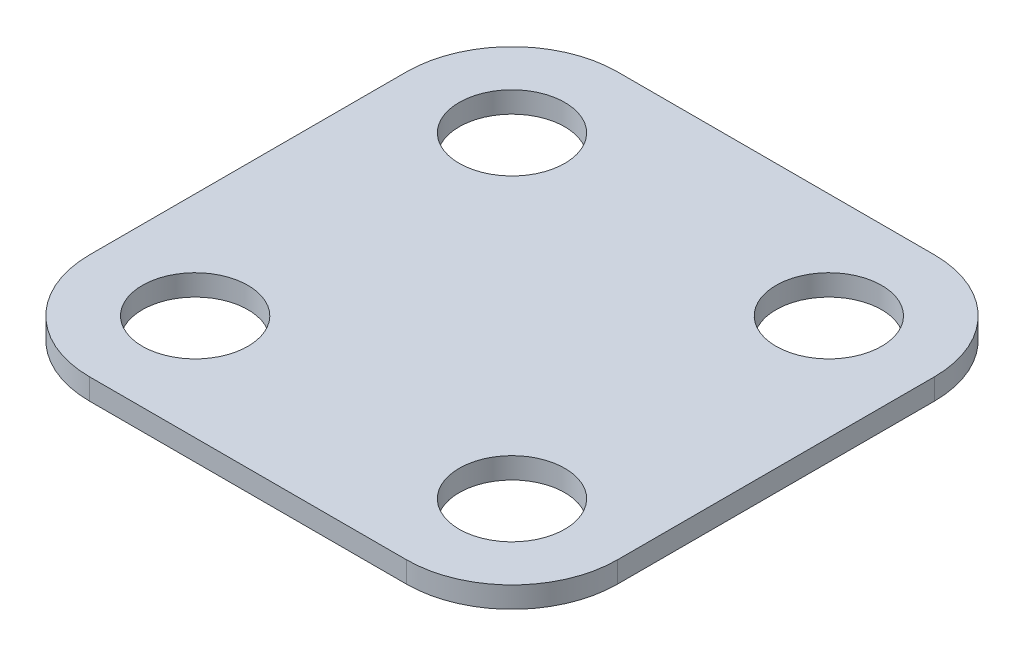
ISO-10303-21;
HEADER;
FILE_DESCRIPTION(('STEP AP214'),'2;1');
FILE_NAME('part.step','',(''),(''),'','','');
FILE_SCHEMA(('AUTOMOTIVE_DESIGN { 1 0 10303 214 1 1 1 1 }'));
ENDSEC;
DATA;
#1=APPLICATION_CONTEXT('core data for automotive mechanical design processes');
#2=APPLICATION_PROTOCOL_DEFINITION('international standard','automotive_design',2000,#1);
#3=PRODUCT_CONTEXT('',#1,'mechanical');
#4=PRODUCT('Part','Part','',(#3));
#5=PRODUCT_RELATED_PRODUCT_CATEGORY('part','',(#4));
#6=PRODUCT_DEFINITION_FORMATION('','',#4);
#7=PRODUCT_DEFINITION_CONTEXT('part definition',#1,'design');
#8=PRODUCT_DEFINITION('design','',#6,#7);
#9=PRODUCT_DEFINITION_SHAPE('','',#8);
#10=(LENGTH_UNIT() NAMED_UNIT(*) SI_UNIT(.MILLI.,.METRE.));
#11=(NAMED_UNIT(*) PLANE_ANGLE_UNIT() SI_UNIT($,.RADIAN.));
#12=(NAMED_UNIT(*) SI_UNIT($,.STERADIAN.) SOLID_ANGLE_UNIT());
#13=UNCERTAINTY_MEASURE_WITH_UNIT(LENGTH_MEASURE(1.E-05),#10,'distance_accuracy_value','');
#14=(GEOMETRIC_REPRESENTATION_CONTEXT(3) GLOBAL_UNCERTAINTY_ASSIGNED_CONTEXT((#13)) GLOBAL_UNIT_ASSIGNED_CONTEXT((#10,
#11,#12)) REPRESENTATION_CONTEXT('',''));
#15=CARTESIAN_POINT('',(0.,0.,0.));
#16=DIRECTION('',(0.,0.,1.));
#17=DIRECTION('',(1.,0.,0.));
#18=AXIS2_PLACEMENT_3D('',#15,#16,#17);
#19=CARTESIAN_POINT('',(-15.,-2.,-15.));
#20=DIRECTION('',(0.,1.,0.));
#21=DIRECTION('',(0.,0.,1.));
#22=AXIS2_PLACEMENT_3D('',#19,#20,#21);
#23=CYLINDRICAL_SURFACE('',#22,10.);
#24=CARTESIAN_POINT('',(-15.,0.,-15.));
#25=DIRECTION('',(0.,1.,0.));
#26=DIRECTION('',(0.,0.,1.));
#27=AXIS2_PLACEMENT_3D('',#24,#25,#26);
#28=CIRCLE('',#27,10.);
#29=CARTESIAN_POINT('',(-15.,0.,-25.));
#30=VERTEX_POINT('',#29);
#31=CARTESIAN_POINT('',(-25.,0.,-15.));
#32=VERTEX_POINT('',#31);
#33=EDGE_CURVE('E134',#30,#32,#28,.T.);
#34=ORIENTED_EDGE('',*,*,#33,.F.);
#35=DIRECTION('',(0.,1.,0.));
#36=VECTOR('',#35,1.);
#37=CARTESIAN_POINT('',(-15.,-2.,-25.));
#38=LINE('',#37,#36);
#39=CARTESIAN_POINT('',(-15.,-2.,-25.));
#40=VERTEX_POINT('',#39);
#41=EDGE_CURVE('E11',#40,#30,#38,.T.);
#42=ORIENTED_EDGE('',*,*,#41,.F.);
#43=CARTESIAN_POINT('',(-15.,-2.,-15.));
#44=DIRECTION('',(0.,1.,0.));
#45=DIRECTION('',(0.,0.,1.));
#46=AXIS2_PLACEMENT_3D('',#43,#44,#45);
#47=CIRCLE('',#46,10.);
#48=CARTESIAN_POINT('',(-25.,-2.,-15.));
#49=VERTEX_POINT('',#48);
#50=EDGE_CURVE('E155',#40,#49,#47,.T.);
#51=ORIENTED_EDGE('',*,*,#50,.T.);
#52=DIRECTION('',(0.,1.,0.));
#53=VECTOR('',#52,1.);
#54=CARTESIAN_POINT('',(-25.,-2.,-15.));
#55=LINE('',#54,#53);
#56=EDGE_CURVE('E40',#49,#32,#55,.T.);
#57=ORIENTED_EDGE('',*,*,#56,.T.);
#58=EDGE_LOOP('',(#34,#42,#51,#57));
#59=FACE_BOUND('',#58,.T.);
#60=ADVANCED_FACE('F37',(#59),#23,.T.);
#61=CARTESIAN_POINT('',(-15.,-2.,-25.));
#62=DIRECTION('',(0.,0.,-1.));
#63=DIRECTION('',(-1.,0.,0.));
#64=AXIS2_PLACEMENT_3D('',#61,#62,#63);
#65=PLANE('',#64);
#66=DIRECTION('',(-1.,0.,0.));
#67=VECTOR('',#66,1.);
#68=CARTESIAN_POINT('',(-15.,0.,-25.));
#69=LINE('',#68,#67);
#70=CARTESIAN_POINT('',(15.,0.,-25.));
#71=VERTEX_POINT('',#70);
#72=EDGE_CURVE('E153',#71,#30,#69,.T.);
#73=ORIENTED_EDGE('',*,*,#72,.F.);
#74=DIRECTION('',(0.,1.,0.));
#75=VECTOR('',#74,1.);
#76=CARTESIAN_POINT('',(15.,-2.,-25.));
#77=LINE('',#76,#75);
#78=CARTESIAN_POINT('',(15.,-2.,-25.));
#79=VERTEX_POINT('',#78);
#80=EDGE_CURVE('E46',#79,#71,#77,.T.);
#81=ORIENTED_EDGE('',*,*,#80,.F.);
#82=DIRECTION('',(-1.,0.,0.));
#83=VECTOR('',#82,1.);
#84=CARTESIAN_POINT('',(-15.,-2.,-25.));
#85=LINE('',#84,#83);
#86=EDGE_CURVE('E124',#79,#40,#85,.T.);
#87=ORIENTED_EDGE('',*,*,#86,.T.);
#88=ORIENTED_EDGE('',*,*,#41,.T.);
#89=EDGE_LOOP('',(#73,#81,#87,#88));
#90=FACE_BOUND('',#89,.T.);
#91=ADVANCED_FACE('F167',(#90),#65,.T.);
#92=CARTESIAN_POINT('',(15.,-2.,-15.));
#93=DIRECTION('',(0.,1.,0.));
#94=DIRECTION('',(0.,0.,1.));
#95=AXIS2_PLACEMENT_3D('',#92,#93,#94);
#96=CYLINDRICAL_SURFACE('',#95,10.);
#97=CARTESIAN_POINT('',(15.,0.,-15.));
#98=DIRECTION('',(0.,1.,0.));
#99=DIRECTION('',(0.,0.,-1.));
#100=AXIS2_PLACEMENT_3D('',#97,#98,#99);
#101=CIRCLE('',#100,10.);
#102=CARTESIAN_POINT('',(25.,0.,-15.));
#103=VERTEX_POINT('',#102);
#104=EDGE_CURVE('E111',#103,#71,#101,.T.);
#105=ORIENTED_EDGE('',*,*,#104,.F.);
#106=DIRECTION('',(0.,1.,0.));
#107=VECTOR('',#106,1.);
#108=CARTESIAN_POINT('',(25.,-2.,-15.));
#109=LINE('',#108,#107);
#110=CARTESIAN_POINT('',(25.,-2.,-15.));
#111=VERTEX_POINT('',#110);
#112=EDGE_CURVE('E106',#111,#103,#109,.T.);
#113=ORIENTED_EDGE('',*,*,#112,.F.);
#114=CARTESIAN_POINT('',(15.,-2.,-15.));
#115=DIRECTION('',(0.,1.,0.));
#116=DIRECTION('',(0.,0.,-1.));
#117=AXIS2_PLACEMENT_3D('',#114,#115,#116);
#118=CIRCLE('',#117,10.);
#119=EDGE_CURVE('E109',#111,#79,#118,.T.);
#120=ORIENTED_EDGE('',*,*,#119,.T.);
#121=ORIENTED_EDGE('',*,*,#80,.T.);
#122=EDGE_LOOP('',(#105,#113,#120,#121));
#123=FACE_BOUND('',#122,.T.);
#124=ADVANCED_FACE('F108',(#123),#96,.T.);
#125=CARTESIAN_POINT('',(25.,-2.,-15.));
#126=DIRECTION('',(1.,0.,0.));
#127=DIRECTION('',(0.,0.,-1.));
#128=AXIS2_PLACEMENT_3D('',#125,#126,#127);
#129=PLANE('',#128);
#130=DIRECTION('',(0.,0.,-1.));
#131=VECTOR('',#130,1.);
#132=CARTESIAN_POINT('',(25.,0.,-15.));
#133=LINE('',#132,#131);
#134=CARTESIAN_POINT('',(25.,0.,15.));
#135=VERTEX_POINT('',#134);
#136=EDGE_CURVE('E150',#135,#103,#133,.T.);
#137=ORIENTED_EDGE('',*,*,#136,.F.);
#138=DIRECTION('',(0.,1.,0.));
#139=VECTOR('',#138,1.);
#140=CARTESIAN_POINT('',(25.,-2.,15.));
#141=LINE('',#140,#139);
#142=CARTESIAN_POINT('',(25.,-2.,15.));
#143=VERTEX_POINT('',#142);
#144=EDGE_CURVE('E116',#143,#135,#141,.T.);
#145=ORIENTED_EDGE('',*,*,#144,.F.);
#146=DIRECTION('',(0.,0.,-1.));
#147=VECTOR('',#146,1.);
#148=CARTESIAN_POINT('',(25.,-2.,-15.));
#149=LINE('',#148,#147);
#150=EDGE_CURVE('E122',#143,#111,#149,.T.);
#151=ORIENTED_EDGE('',*,*,#150,.T.);
#152=ORIENTED_EDGE('',*,*,#112,.T.);
#153=EDGE_LOOP('',(#137,#145,#151,#152));
#154=FACE_BOUND('',#153,.T.);
#155=ADVANCED_FACE('F126',(#154),#129,.T.);
#156=CARTESIAN_POINT('',(15.,-2.,15.));
#157=DIRECTION('',(0.,1.,0.));
#158=DIRECTION('',(0.,0.,1.));
#159=AXIS2_PLACEMENT_3D('',#156,#157,#158);
#160=CYLINDRICAL_SURFACE('',#159,10.);
#161=CARTESIAN_POINT('',(15.,0.,15.));
#162=DIRECTION('',(0.,1.,0.));
#163=DIRECTION('',(0.,0.,1.));
#164=AXIS2_PLACEMENT_3D('',#161,#162,#163);
#165=CIRCLE('',#164,10.);
#166=CARTESIAN_POINT('',(15.,0.,25.));
#167=VERTEX_POINT('',#166);
#168=EDGE_CURVE('E147',#167,#135,#165,.T.);
#169=ORIENTED_EDGE('',*,*,#168,.F.);
#170=DIRECTION('',(0.,1.,0.));
#171=VECTOR('',#170,1.);
#172=CARTESIAN_POINT('',(15.,-2.,25.));
#173=LINE('',#172,#171);
#174=CARTESIAN_POINT('',(15.,-2.,25.));
#175=VERTEX_POINT('',#174);
#176=EDGE_CURVE('E159',#175,#167,#173,.T.);
#177=ORIENTED_EDGE('',*,*,#176,.F.);
#178=CARTESIAN_POINT('',(15.,-2.,15.));
#179=DIRECTION('',(0.,1.,0.));
#180=DIRECTION('',(0.,0.,1.));
#181=AXIS2_PLACEMENT_3D('',#178,#179,#180);
#182=CIRCLE('',#181,10.);
#183=EDGE_CURVE('E127',#175,#143,#182,.T.);
#184=ORIENTED_EDGE('',*,*,#183,.T.);
#185=ORIENTED_EDGE('',*,*,#144,.T.);
#186=EDGE_LOOP('',(#169,#177,#184,#185));
#187=FACE_BOUND('',#186,.T.);
#188=ADVANCED_FACE('F180',(#187),#160,.T.);
#189=CARTESIAN_POINT('',(-15.,-2.,25.));
#190=DIRECTION('',(0.,0.,1.));
#191=DIRECTION('',(1.,0.,0.));
#192=AXIS2_PLACEMENT_3D('',#189,#190,#191);
#193=PLANE('',#192);
#194=DIRECTION('',(1.,0.,0.));
#195=VECTOR('',#194,1.);
#196=CARTESIAN_POINT('',(-15.,0.,25.));
#197=LINE('',#196,#195);
#198=CARTESIAN_POINT('',(-15.,0.,25.));
#199=VERTEX_POINT('',#198);
#200=EDGE_CURVE('E144',#199,#167,#197,.T.);
#201=ORIENTED_EDGE('',*,*,#200,.F.);
#202=DIRECTION('',(0.,1.,0.));
#203=VECTOR('',#202,1.);
#204=CARTESIAN_POINT('',(-15.,-2.,25.));
#205=LINE('',#204,#203);
#206=CARTESIAN_POINT('',(-15.,-2.,25.));
#207=VERTEX_POINT('',#206);
#208=EDGE_CURVE('E161',#207,#199,#205,.T.);
#209=ORIENTED_EDGE('',*,*,#208,.F.);
#210=DIRECTION('',(1.,0.,0.));
#211=VECTOR('',#210,1.);
#212=CARTESIAN_POINT('',(-15.,-2.,25.));
#213=LINE('',#212,#211);
#214=EDGE_CURVE('E129',#207,#175,#213,.T.);
#215=ORIENTED_EDGE('',*,*,#214,.T.);
#216=ORIENTED_EDGE('',*,*,#176,.T.);
#217=EDGE_LOOP('',(#201,#209,#215,#216));
#218=FACE_BOUND('',#217,.T.);
#219=ADVANCED_FACE('F183',(#218),#193,.T.);
#220=CARTESIAN_POINT('',(-15.,-2.,15.));
#221=DIRECTION('',(0.,1.,0.));
#222=DIRECTION('',(0.,0.,1.));
#223=AXIS2_PLACEMENT_3D('',#220,#221,#222);
#224=CYLINDRICAL_SURFACE('',#223,10.);
#225=CARTESIAN_POINT('',(-15.,0.,15.));
#226=DIRECTION('',(0.,1.,0.));
#227=DIRECTION('',(0.,0.,1.));
#228=AXIS2_PLACEMENT_3D('',#225,#226,#227);
#229=CIRCLE('',#228,10.);
#230=CARTESIAN_POINT('',(-25.,0.,15.));
#231=VERTEX_POINT('',#230);
#232=EDGE_CURVE('E141',#231,#199,#229,.T.);
#233=ORIENTED_EDGE('',*,*,#232,.F.);
#234=DIRECTION('',(0.,1.,0.));
#235=VECTOR('',#234,1.);
#236=CARTESIAN_POINT('',(-25.,-2.,15.));
#237=LINE('',#236,#235);
#238=CARTESIAN_POINT('',(-25.,-2.,15.));
#239=VERTEX_POINT('',#238);
#240=EDGE_CURVE('E162',#239,#231,#237,.T.);
#241=ORIENTED_EDGE('',*,*,#240,.F.);
#242=CARTESIAN_POINT('',(-15.,-2.,15.));
#243=DIRECTION('',(0.,1.,0.));
#244=DIRECTION('',(0.,0.,1.));
#245=AXIS2_PLACEMENT_3D('',#242,#243,#244);
#246=CIRCLE('',#245,10.);
#247=EDGE_CURVE('E249',#239,#207,#246,.T.);
#248=ORIENTED_EDGE('',*,*,#247,.T.);
#249=ORIENTED_EDGE('',*,*,#208,.T.);
#250=EDGE_LOOP('',(#233,#241,#248,#249));
#251=FACE_BOUND('',#250,.T.);
#252=ADVANCED_FACE('F187',(#251),#224,.T.);
#253=CARTESIAN_POINT('',(-25.,-2.,-15.));
#254=DIRECTION('',(-1.,0.,0.));
#255=DIRECTION('',(0.,0.,1.));
#256=AXIS2_PLACEMENT_3D('',#253,#254,#255);
#257=PLANE('',#256);
#258=DIRECTION('',(0.,0.,1.));
#259=VECTOR('',#258,1.);
#260=CARTESIAN_POINT('',(-25.,0.,-15.));
#261=LINE('',#260,#259);
#262=EDGE_CURVE('E137',#32,#231,#261,.T.);
#263=ORIENTED_EDGE('',*,*,#262,.F.);
#264=ORIENTED_EDGE('',*,*,#56,.F.);
#265=DIRECTION('',(0.,0.,1.));
#266=VECTOR('',#265,1.);
#267=CARTESIAN_POINT('',(-25.,-2.,-15.));
#268=LINE('',#267,#266);
#269=EDGE_CURVE('E247',#49,#239,#268,.T.);
#270=ORIENTED_EDGE('',*,*,#269,.T.);
#271=ORIENTED_EDGE('',*,*,#240,.T.);
#272=EDGE_LOOP('',(#263,#264,#270,#271));
#273=FACE_BOUND('',#272,.T.);
#274=ADVANCED_FACE('F164',(#273),#257,.T.);
#275=CARTESIAN_POINT('',(-15.,-2.,-15.));
#276=DIRECTION('',(0.,1.,0.));
#277=DIRECTION('',(0.,0.,1.));
#278=AXIS2_PLACEMENT_3D('',#275,#276,#277);
#279=PLANE('',#278);
#280=CARTESIAN_POINT('',(-15.,-2.,-14.9999999999985));
#281=DIRECTION('',(0.,1.,0.));
#282=DIRECTION('',(0.,0.,1.));
#283=AXIS2_PLACEMENT_3D('',#280,#281,#282);
#284=CIRCLE('',#283,5.);
#285=CARTESIAN_POINT('',(-15.,-2.,-9.99999999999852));
#286=VERTEX_POINT('',#285);
#287=EDGE_CURVE('E222',#286,#286,#284,.T.);
#288=ORIENTED_EDGE('',*,*,#287,.T.);
#289=EDGE_LOOP('',(#288));
#290=FACE_BOUND('',#289,.T.);
#291=CARTESIAN_POINT('',(-14.9999999999985,-2.,15.0000000000015));
#292=DIRECTION('',(0.,1.,0.));
#293=DIRECTION('',(0.,0.,1.));
#294=AXIS2_PLACEMENT_3D('',#291,#292,#293);
#295=CIRCLE('',#294,5.);
#296=CARTESIAN_POINT('',(-14.9999999999985,-2.,20.0000000000015));
#297=VERTEX_POINT('',#296);
#298=EDGE_CURVE('E230',#297,#297,#295,.T.);
#299=ORIENTED_EDGE('',*,*,#298,.T.);
#300=EDGE_LOOP('',(#299));
#301=FACE_BOUND('',#300,.T.);
#302=CARTESIAN_POINT('',(15.0000000000015,-2.,15.));
#303=DIRECTION('',(0.,1.,0.));
#304=DIRECTION('',(0.,0.,1.));
#305=AXIS2_PLACEMENT_3D('',#302,#303,#304);
#306=CIRCLE('',#305,5.);
#307=CARTESIAN_POINT('',(15.0000000000015,-2.,20.));
#308=VERTEX_POINT('',#307);
#309=EDGE_CURVE('E236',#308,#308,#306,.T.);
#310=ORIENTED_EDGE('',*,*,#309,.T.);
#311=EDGE_LOOP('',(#310));
#312=FACE_BOUND('',#311,.T.);
#313=CARTESIAN_POINT('',(15.,-2.,-15.));
#314=DIRECTION('',(0.,1.,0.));
#315=DIRECTION('',(0.,0.,1.));
#316=AXIS2_PLACEMENT_3D('',#313,#314,#315);
#317=CIRCLE('',#316,4.99999999999999);
#318=CARTESIAN_POINT('',(15.,-2.,-10.));
#319=VERTEX_POINT('',#318);
#320=EDGE_CURVE('E138',#319,#319,#317,.T.);
#321=ORIENTED_EDGE('',*,*,#320,.T.);
#322=EDGE_LOOP('',(#321));
#323=FACE_BOUND('',#322,.T.);
#324=ORIENTED_EDGE('',*,*,#50,.F.);
#325=ORIENTED_EDGE('',*,*,#86,.F.);
#326=ORIENTED_EDGE('',*,*,#119,.F.);
#327=ORIENTED_EDGE('',*,*,#150,.F.);
#328=ORIENTED_EDGE('',*,*,#183,.F.);
#329=ORIENTED_EDGE('',*,*,#214,.F.);
#330=ORIENTED_EDGE('',*,*,#247,.F.);
#331=ORIENTED_EDGE('',*,*,#269,.F.);
#332=EDGE_LOOP('',(#324,#325,#326,#327,#328,#329,#330,#331));
#333=FACE_BOUND('',#332,.T.);
#334=ADVANCED_FACE('F120',(#290,#301,#312,#323,#333),#279,.F.);
#335=CARTESIAN_POINT('',(-15.,0.,-15.));
#336=DIRECTION('',(0.,1.,0.));
#337=DIRECTION('',(0.,0.,1.));
#338=AXIS2_PLACEMENT_3D('',#335,#336,#337);
#339=PLANE('',#338);
#340=CARTESIAN_POINT('',(-15.,0.,-14.9999999999985));
#341=DIRECTION('',(0.,1.,0.));
#342=DIRECTION('',(0.,0.,1.));
#343=AXIS2_PLACEMENT_3D('',#340,#341,#342);
#344=CIRCLE('',#343,5.);
#345=CARTESIAN_POINT('',(-15.,0.,-9.99999999999852));
#346=VERTEX_POINT('',#345);
#347=EDGE_CURVE('E225',#346,#346,#344,.T.);
#348=ORIENTED_EDGE('',*,*,#347,.F.);
#349=EDGE_LOOP('',(#348));
#350=FACE_BOUND('',#349,.T.);
#351=CARTESIAN_POINT('',(-14.9999999999985,0.,15.0000000000015));
#352=DIRECTION('',(0.,1.,0.));
#353=DIRECTION('',(0.,0.,1.));
#354=AXIS2_PLACEMENT_3D('',#351,#352,#353);
#355=CIRCLE('',#354,5.);
#356=CARTESIAN_POINT('',(-14.9999999999985,0.,20.0000000000015));
#357=VERTEX_POINT('',#356);
#358=EDGE_CURVE('E227',#357,#357,#355,.T.);
#359=ORIENTED_EDGE('',*,*,#358,.F.);
#360=EDGE_LOOP('',(#359));
#361=FACE_BOUND('',#360,.T.);
#362=CARTESIAN_POINT('',(15.0000000000015,0.,15.));
#363=DIRECTION('',(0.,1.,0.));
#364=DIRECTION('',(0.,0.,1.));
#365=AXIS2_PLACEMENT_3D('',#362,#363,#364);
#366=CIRCLE('',#365,5.);
#367=CARTESIAN_POINT('',(15.0000000000015,0.,20.));
#368=VERTEX_POINT('',#367);
#369=EDGE_CURVE('E233',#368,#368,#366,.T.);
#370=ORIENTED_EDGE('',*,*,#369,.F.);
#371=EDGE_LOOP('',(#370));
#372=FACE_BOUND('',#371,.T.);
#373=CARTESIAN_POINT('',(15.,0.,-15.));
#374=DIRECTION('',(0.,1.,0.));
#375=DIRECTION('',(0.,0.,1.));
#376=AXIS2_PLACEMENT_3D('',#373,#374,#375);
#377=CIRCLE('',#376,4.99999999999999);
#378=CARTESIAN_POINT('',(15.,0.,-10.));
#379=VERTEX_POINT('',#378);
#380=EDGE_CURVE('E239',#379,#379,#377,.T.);
#381=ORIENTED_EDGE('',*,*,#380,.F.);
#382=EDGE_LOOP('',(#381));
#383=FACE_BOUND('',#382,.T.);
#384=ORIENTED_EDGE('',*,*,#33,.T.);
#385=ORIENTED_EDGE('',*,*,#262,.T.);
#386=ORIENTED_EDGE('',*,*,#232,.T.);
#387=ORIENTED_EDGE('',*,*,#200,.T.);
#388=ORIENTED_EDGE('',*,*,#168,.T.);
#389=ORIENTED_EDGE('',*,*,#136,.T.);
#390=ORIENTED_EDGE('',*,*,#104,.T.);
#391=ORIENTED_EDGE('',*,*,#72,.T.);
#392=EDGE_LOOP('',(#384,#385,#386,#387,#388,#389,#390,#391));
#393=FACE_BOUND('',#392,.T.);
#394=ADVANCED_FACE('F166',(#350,#361,#372,#383,#393),#339,.T.);
#395=CARTESIAN_POINT('',(15.,-2.,-15.));
#396=DIRECTION('',(0.,1.,0.));
#397=DIRECTION('',(0.,0.,1.));
#398=AXIS2_PLACEMENT_3D('',#395,#396,#397);
#399=CYLINDRICAL_SURFACE('',#398,4.99999999999999);
#400=ORIENTED_EDGE('',*,*,#320,.F.);
#401=EDGE_LOOP('',(#400));
#402=FACE_BOUND('',#401,.T.);
#403=ORIENTED_EDGE('',*,*,#380,.T.);
#404=EDGE_LOOP('',(#403));
#405=FACE_BOUND('',#404,.T.);
#406=ADVANCED_FACE('F199',(#402,#405),#399,.F.);
#407=CARTESIAN_POINT('',(15.0000000000015,-2.,15.));
#408=DIRECTION('',(0.,1.,0.));
#409=DIRECTION('',(0.,0.,1.));
#410=AXIS2_PLACEMENT_3D('',#407,#408,#409);
#411=CYLINDRICAL_SURFACE('',#410,5.);
#412=ORIENTED_EDGE('',*,*,#309,.F.);
#413=EDGE_LOOP('',(#412));
#414=FACE_BOUND('',#413,.T.);
#415=ORIENTED_EDGE('',*,*,#369,.T.);
#416=EDGE_LOOP('',(#415));
#417=FACE_BOUND('',#416,.T.);
#418=ADVANCED_FACE('F206',(#414,#417),#411,.F.);
#419=CARTESIAN_POINT('',(-14.9999999999985,-2.,15.0000000000015));
#420=DIRECTION('',(0.,1.,0.));
#421=DIRECTION('',(0.,0.,1.));
#422=AXIS2_PLACEMENT_3D('',#419,#420,#421);
#423=CYLINDRICAL_SURFACE('',#422,5.);
#424=ORIENTED_EDGE('',*,*,#298,.F.);
#425=EDGE_LOOP('',(#424));
#426=FACE_BOUND('',#425,.T.);
#427=ORIENTED_EDGE('',*,*,#358,.T.);
#428=EDGE_LOOP('',(#427));
#429=FACE_BOUND('',#428,.T.);
#430=ADVANCED_FACE('F210',(#426,#429),#423,.F.);
#431=CARTESIAN_POINT('',(-15.,-2.,-14.9999999999985));
#432=DIRECTION('',(0.,1.,0.));
#433=DIRECTION('',(0.,0.,1.));
#434=AXIS2_PLACEMENT_3D('',#431,#432,#433);
#435=CYLINDRICAL_SURFACE('',#434,5.);
#436=ORIENTED_EDGE('',*,*,#287,.F.);
#437=EDGE_LOOP('',(#436));
#438=FACE_BOUND('',#437,.T.);
#439=ORIENTED_EDGE('',*,*,#347,.T.);
#440=EDGE_LOOP('',(#439));
#441=FACE_BOUND('',#440,.T.);
#442=ADVANCED_FACE('F214',(#438,#441),#435,.F.);
#443=CLOSED_SHELL('',(#60,#91,#124,#155,#188,#219,#252,#274,#334,#394,#406,#418,#430,#442));
#444=MANIFOLD_SOLID_BREP('B2',#443);
#445=ADVANCED_BREP_SHAPE_REPRESENTATION('',(#18,#444),#14);
#446=SHAPE_DEFINITION_REPRESENTATION(#9,#445);
ENDSEC;
END-ISO-10303-21;
